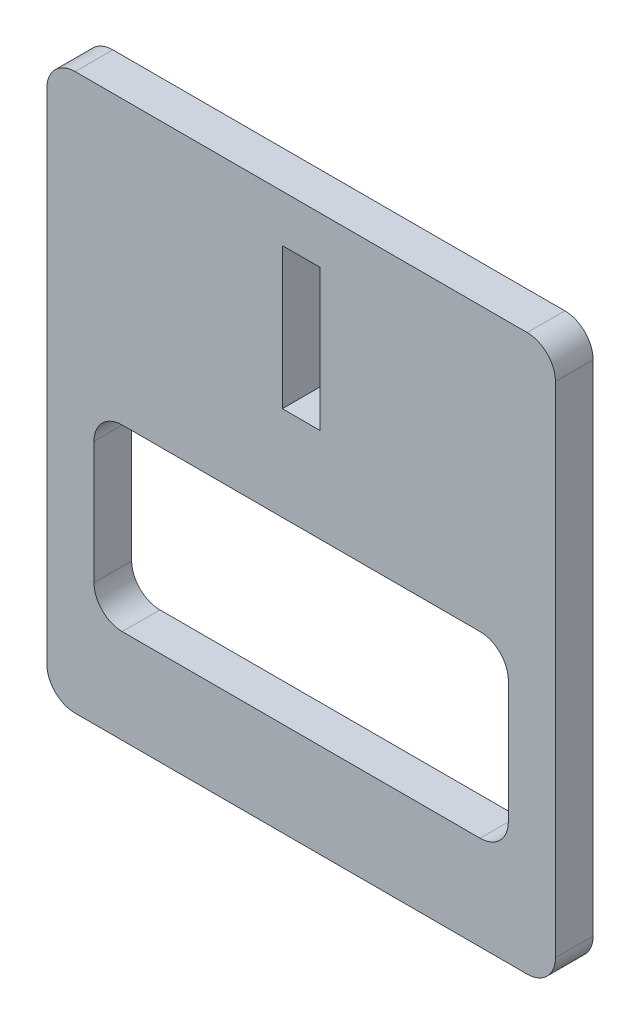
ISO-10303-21;
HEADER;
FILE_DESCRIPTION(('STEP AP214'),'2;1');
FILE_NAME('part.step','',(''),(''),'','','');
FILE_SCHEMA(('AUTOMOTIVE_DESIGN { 1 0 10303 214 1 1 1 1 }'));
ENDSEC;
DATA;
#1=APPLICATION_CONTEXT('core data for automotive mechanical design processes');
#2=APPLICATION_PROTOCOL_DEFINITION('international standard','automotive_design',2000,#1);
#3=PRODUCT_CONTEXT('',#1,'mechanical');
#4=PRODUCT('Part','Part','',(#3));
#5=PRODUCT_RELATED_PRODUCT_CATEGORY('part','',(#4));
#6=PRODUCT_DEFINITION_FORMATION('','',#4);
#7=PRODUCT_DEFINITION_CONTEXT('part definition',#1,'design');
#8=PRODUCT_DEFINITION('design','',#6,#7);
#9=PRODUCT_DEFINITION_SHAPE('','',#8);
#10=(LENGTH_UNIT() NAMED_UNIT(*) SI_UNIT(.MILLI.,.METRE.));
#11=(NAMED_UNIT(*) PLANE_ANGLE_UNIT() SI_UNIT($,.RADIAN.));
#12=(NAMED_UNIT(*) SI_UNIT($,.STERADIAN.) SOLID_ANGLE_UNIT());
#13=UNCERTAINTY_MEASURE_WITH_UNIT(LENGTH_MEASURE(1.E-05),#10,'distance_accuracy_value','');
#14=(GEOMETRIC_REPRESENTATION_CONTEXT(3) GLOBAL_UNCERTAINTY_ASSIGNED_CONTEXT((#13)) GLOBAL_UNIT_ASSIGNED_CONTEXT((#10,
#11,#12)) REPRESENTATION_CONTEXT('',''));
#15=CARTESIAN_POINT('',(0.,0.,0.));
#16=DIRECTION('',(0.,0.,1.));
#17=DIRECTION('',(1.,0.,0.));
#18=AXIS2_PLACEMENT_3D('',#15,#16,#17);
#19=CARTESIAN_POINT('',(-2.,46.,4.));
#20=DIRECTION('',(0.,0.,-1.));
#21=DIRECTION('',(-1.,0.,0.));
#22=AXIS2_PLACEMENT_3D('',#19,#20,#21);
#23=PLANE('',#22);
#24=CARTESIAN_POINT('',(41.,16.,4.));
#25=DIRECTION('',(0.,0.,1.));
#26=DIRECTION('',(-1.,0.,0.));
#27=AXIS2_PLACEMENT_3D('',#24,#25,#26);
#28=CIRCLE('',#27,3.);
#29=CARTESIAN_POINT('',(44.,16.,4.));
#30=VERTEX_POINT('',#29);
#31=CARTESIAN_POINT('',(41.,19.,4.));
#32=VERTEX_POINT('',#31);
#33=EDGE_CURVE('E208',#30,#32,#28,.T.);
#34=ORIENTED_EDGE('',*,*,#33,.F.);
#35=DIRECTION('',(0.,1.,0.));
#36=VECTOR('',#35,1.);
#37=CARTESIAN_POINT('',(44.,3.00000000000002,4.));
#38=LINE('',#37,#36);
#39=CARTESIAN_POINT('',(44.,3.,4.));
#40=VERTEX_POINT('',#39);
#41=EDGE_CURVE('E224',#40,#30,#38,.T.);
#42=ORIENTED_EDGE('',*,*,#41,.F.);
#43=CARTESIAN_POINT('',(41.,3.,4.));
#44=DIRECTION('',(0.,0.,1.));
#45=DIRECTION('',(1.,0.,0.));
#46=AXIS2_PLACEMENT_3D('',#43,#44,#45);
#47=CIRCLE('',#46,3.);
#48=CARTESIAN_POINT('',(41.,0.,4.));
#49=VERTEX_POINT('',#48);
#50=EDGE_CURVE('E221',#49,#40,#47,.T.);
#51=ORIENTED_EDGE('',*,*,#50,.F.);
#52=DIRECTION('',(1.,0.,0.));
#53=VECTOR('',#52,1.);
#54=CARTESIAN_POINT('',(3.00000000000002,0.,4.));
#55=LINE('',#54,#53);
#56=CARTESIAN_POINT('',(3.00000000000002,0.,4.));
#57=VERTEX_POINT('',#56);
#58=EDGE_CURVE('E219',#57,#49,#55,.T.);
#59=ORIENTED_EDGE('',*,*,#58,.F.);
#60=CARTESIAN_POINT('',(3.,3.,4.));
#61=DIRECTION('',(0.,0.,1.));
#62=DIRECTION('',(-1.,0.,0.));
#63=AXIS2_PLACEMENT_3D('',#60,#61,#62);
#64=CIRCLE('',#63,3.);
#65=CARTESIAN_POINT('',(0.,3.00000000000002,4.));
#66=VERTEX_POINT('',#65);
#67=EDGE_CURVE('E217',#66,#57,#64,.T.);
#68=ORIENTED_EDGE('',*,*,#67,.F.);
#69=DIRECTION('',(0.,-1.,0.));
#70=VECTOR('',#69,1.);
#71=CARTESIAN_POINT('',(0.,3.00000000000002,4.));
#72=LINE('',#71,#70);
#73=CARTESIAN_POINT('',(0.,16.,4.));
#74=VERTEX_POINT('',#73);
#75=EDGE_CURVE('E215',#74,#66,#72,.T.);
#76=ORIENTED_EDGE('',*,*,#75,.F.);
#77=CARTESIAN_POINT('',(3.,16.,4.));
#78=DIRECTION('',(0.,0.,1.));
#79=DIRECTION('',(-1.,0.,0.));
#80=AXIS2_PLACEMENT_3D('',#77,#78,#79);
#81=CIRCLE('',#80,3.);
#82=CARTESIAN_POINT('',(3.00000000000002,19.,4.));
#83=VERTEX_POINT('',#82);
#84=EDGE_CURVE('E213',#83,#74,#81,.T.);
#85=ORIENTED_EDGE('',*,*,#84,.F.);
#86=DIRECTION('',(-1.,0.,0.));
#87=VECTOR('',#86,1.);
#88=CARTESIAN_POINT('',(3.00000000000002,19.,4.));
#89=LINE('',#88,#87);
#90=EDGE_CURVE('E210',#32,#83,#89,.T.);
#91=ORIENTED_EDGE('',*,*,#90,.F.);
#92=EDGE_LOOP('',(#34,#42,#51,#59,#68,#76,#85,#91));
#93=FACE_BOUND('',#92,.T.);
#94=CARTESIAN_POINT('',(-2.,46.,4.));
#95=DIRECTION('',(0.,0.,1.));
#96=DIRECTION('',(-1.,0.,0.));
#97=AXIS2_PLACEMENT_3D('',#94,#95,#96);
#98=CIRCLE('',#97,3.);
#99=CARTESIAN_POINT('',(-1.99999999999998,49.,4.));
#100=VERTEX_POINT('',#99);
#101=CARTESIAN_POINT('',(-5.,46.,4.));
#102=VERTEX_POINT('',#101);
#103=EDGE_CURVE('E267',#100,#102,#98,.T.);
#104=ORIENTED_EDGE('',*,*,#103,.T.);
#105=DIRECTION('',(0.,-1.,0.));
#106=VECTOR('',#105,1.);
#107=CARTESIAN_POINT('',(-5.,-6.99999999999998,4.));
#108=LINE('',#107,#106);
#109=CARTESIAN_POINT('',(-5.,-6.99999999999998,4.));
#110=VERTEX_POINT('',#109);
#111=EDGE_CURVE('E270',#102,#110,#108,.T.);
#112=ORIENTED_EDGE('',*,*,#111,.T.);
#113=CARTESIAN_POINT('',(-2.,-7.,4.));
#114=DIRECTION('',(0.,0.,1.));
#115=DIRECTION('',(-1.,0.,0.));
#116=AXIS2_PLACEMENT_3D('',#113,#114,#115);
#117=CIRCLE('',#116,3.);
#118=CARTESIAN_POINT('',(-1.99999999999998,-10.,4.));
#119=VERTEX_POINT('',#118);
#120=EDGE_CURVE('E273',#110,#119,#117,.T.);
#121=ORIENTED_EDGE('',*,*,#120,.T.);
#122=DIRECTION('',(1.,0.,0.));
#123=VECTOR('',#122,1.);
#124=CARTESIAN_POINT('',(-1.99999999999998,-10.,4.));
#125=LINE('',#124,#123);
#126=CARTESIAN_POINT('',(46.,-10.,4.));
#127=VERTEX_POINT('',#126);
#128=EDGE_CURVE('E275',#119,#127,#125,.T.);
#129=ORIENTED_EDGE('',*,*,#128,.T.);
#130=CARTESIAN_POINT('',(46.,-7.,4.));
#131=DIRECTION('',(0.,0.,1.));
#132=DIRECTION('',(1.,0.,0.));
#133=AXIS2_PLACEMENT_3D('',#130,#131,#132);
#134=CIRCLE('',#133,3.);
#135=CARTESIAN_POINT('',(49.,-7.,4.));
#136=VERTEX_POINT('',#135);
#137=EDGE_CURVE('E277',#127,#136,#134,.T.);
#138=ORIENTED_EDGE('',*,*,#137,.T.);
#139=DIRECTION('',(0.,1.,0.));
#140=VECTOR('',#139,1.);
#141=CARTESIAN_POINT('',(49.,-6.99999999999998,4.));
#142=LINE('',#141,#140);
#143=CARTESIAN_POINT('',(49.,46.,4.));
#144=VERTEX_POINT('',#143);
#145=EDGE_CURVE('E279',#136,#144,#142,.T.);
#146=ORIENTED_EDGE('',*,*,#145,.T.);
#147=CARTESIAN_POINT('',(46.,46.,4.));
#148=DIRECTION('',(0.,0.,1.));
#149=DIRECTION('',(-1.,0.,0.));
#150=AXIS2_PLACEMENT_3D('',#147,#148,#149);
#151=CIRCLE('',#150,3.);
#152=CARTESIAN_POINT('',(46.,49.,4.));
#153=VERTEX_POINT('',#152);
#154=EDGE_CURVE('E281',#144,#153,#151,.T.);
#155=ORIENTED_EDGE('',*,*,#154,.T.);
#156=DIRECTION('',(-1.,0.,0.));
#157=VECTOR('',#156,1.);
#158=CARTESIAN_POINT('',(-1.99999999999998,49.,4.));
#159=LINE('',#158,#157);
#160=EDGE_CURVE('E283',#153,#100,#159,.T.);
#161=ORIENTED_EDGE('',*,*,#160,.T.);
#162=EDGE_LOOP('',(#104,#112,#121,#129,#138,#146,#155,#161));
#163=FACE_BOUND('',#162,.T.);
#164=DIRECTION('',(0.,1.,0.));
#165=VECTOR('',#164,1.);
#166=CARTESIAN_POINT('',(24.,29.,4.));
#167=LINE('',#166,#165);
#168=CARTESIAN_POINT('',(24.,29.,4.));
#169=VERTEX_POINT('',#168);
#170=CARTESIAN_POINT('',(24.,44.,4.));
#171=VERTEX_POINT('',#170);
#172=EDGE_CURVE('E172',#169,#171,#167,.T.);
#173=ORIENTED_EDGE('',*,*,#172,.F.);
#174=DIRECTION('',(1.,0.,0.));
#175=VECTOR('',#174,1.);
#176=CARTESIAN_POINT('',(20.,29.,4.));
#177=LINE('',#176,#175);
#178=CARTESIAN_POINT('',(20.,29.,4.));
#179=VERTEX_POINT('',#178);
#180=EDGE_CURVE('E194',#179,#169,#177,.T.);
#181=ORIENTED_EDGE('',*,*,#180,.F.);
#182=DIRECTION('',(0.,-1.,0.));
#183=VECTOR('',#182,1.);
#184=CARTESIAN_POINT('',(20.,29.,4.));
#185=LINE('',#184,#183);
#186=CARTESIAN_POINT('',(20.,44.,4.));
#187=VERTEX_POINT('',#186);
#188=EDGE_CURVE('E192',#187,#179,#185,.T.);
#189=ORIENTED_EDGE('',*,*,#188,.F.);
#190=DIRECTION('',(-1.,0.,0.));
#191=VECTOR('',#190,1.);
#192=CARTESIAN_POINT('',(20.,44.,4.));
#193=LINE('',#192,#191);
#194=EDGE_CURVE('E180',#171,#187,#193,.T.);
#195=ORIENTED_EDGE('',*,*,#194,.F.);
#196=EDGE_LOOP('',(#173,#181,#189,#195));
#197=FACE_BOUND('',#196,.T.);
#198=ADVANCED_FACE('F35',(#93,#163,#197),#23,.F.);
#199=CARTESIAN_POINT('',(-2.,46.,0.));
#200=DIRECTION('',(0.,0.,-1.));
#201=DIRECTION('',(-1.,0.,0.));
#202=AXIS2_PLACEMENT_3D('',#199,#200,#201);
#203=PLANE('',#202);
#204=CARTESIAN_POINT('',(-2.,46.,0.));
#205=DIRECTION('',(0.,0.,1.));
#206=DIRECTION('',(-1.,0.,0.));
#207=AXIS2_PLACEMENT_3D('',#204,#205,#206);
#208=CIRCLE('',#207,3.);
#209=CARTESIAN_POINT('',(-1.99999999999998,49.,0.));
#210=VERTEX_POINT('',#209);
#211=CARTESIAN_POINT('',(-5.,46.,0.));
#212=VERTEX_POINT('',#211);
#213=EDGE_CURVE('E266',#210,#212,#208,.T.);
#214=ORIENTED_EDGE('',*,*,#213,.F.);
#215=DIRECTION('',(-1.,0.,0.));
#216=VECTOR('',#215,1.);
#217=CARTESIAN_POINT('',(-1.99999999999998,49.,0.));
#218=LINE('',#217,#216);
#219=CARTESIAN_POINT('',(46.,49.,0.));
#220=VERTEX_POINT('',#219);
#221=EDGE_CURVE('E271',#220,#210,#218,.T.);
#222=ORIENTED_EDGE('',*,*,#221,.F.);
#223=CARTESIAN_POINT('',(46.,46.,0.));
#224=DIRECTION('',(0.,0.,1.));
#225=DIRECTION('',(-1.,0.,0.));
#226=AXIS2_PLACEMENT_3D('',#223,#224,#225);
#227=CIRCLE('',#226,3.);
#228=CARTESIAN_POINT('',(49.,46.,0.));
#229=VERTEX_POINT('',#228);
#230=EDGE_CURVE('E298',#229,#220,#227,.T.);
#231=ORIENTED_EDGE('',*,*,#230,.F.);
#232=DIRECTION('',(0.,1.,0.));
#233=VECTOR('',#232,1.);
#234=CARTESIAN_POINT('',(49.,-6.99999999999998,0.));
#235=LINE('',#234,#233);
#236=CARTESIAN_POINT('',(49.,-7.,0.));
#237=VERTEX_POINT('',#236);
#238=EDGE_CURVE('E296',#237,#229,#235,.T.);
#239=ORIENTED_EDGE('',*,*,#238,.F.);
#240=CARTESIAN_POINT('',(46.,-7.,0.));
#241=DIRECTION('',(0.,0.,1.));
#242=DIRECTION('',(1.,0.,0.));
#243=AXIS2_PLACEMENT_3D('',#240,#241,#242);
#244=CIRCLE('',#243,3.);
#245=CARTESIAN_POINT('',(46.,-10.,0.));
#246=VERTEX_POINT('',#245);
#247=EDGE_CURVE('E294',#246,#237,#244,.T.);
#248=ORIENTED_EDGE('',*,*,#247,.F.);
#249=DIRECTION('',(1.,0.,0.));
#250=VECTOR('',#249,1.);
#251=CARTESIAN_POINT('',(-1.99999999999998,-10.,0.));
#252=LINE('',#251,#250);
#253=CARTESIAN_POINT('',(-1.99999999999998,-10.,0.));
#254=VERTEX_POINT('',#253);
#255=EDGE_CURVE('E292',#254,#246,#252,.T.);
#256=ORIENTED_EDGE('',*,*,#255,.F.);
#257=CARTESIAN_POINT('',(-2.,-7.,0.));
#258=DIRECTION('',(0.,0.,1.));
#259=DIRECTION('',(-1.,0.,0.));
#260=AXIS2_PLACEMENT_3D('',#257,#258,#259);
#261=CIRCLE('',#260,3.);
#262=CARTESIAN_POINT('',(-5.,-6.99999999999998,0.));
#263=VERTEX_POINT('',#262);
#264=EDGE_CURVE('E290',#263,#254,#261,.T.);
#265=ORIENTED_EDGE('',*,*,#264,.F.);
#266=DIRECTION('',(0.,-1.,0.));
#267=VECTOR('',#266,1.);
#268=CARTESIAN_POINT('',(-5.,-6.99999999999998,0.));
#269=LINE('',#268,#267);
#270=EDGE_CURVE('E288',#212,#263,#269,.T.);
#271=ORIENTED_EDGE('',*,*,#270,.F.);
#272=EDGE_LOOP('',(#214,#222,#231,#239,#248,#256,#265,#271));
#273=FACE_BOUND('',#272,.T.);
#274=DIRECTION('',(0.,1.,0.));
#275=VECTOR('',#274,1.);
#276=CARTESIAN_POINT('',(44.,3.00000000000002,0.));
#277=LINE('',#276,#275);
#278=CARTESIAN_POINT('',(44.,3.,0.));
#279=VERTEX_POINT('',#278);
#280=CARTESIAN_POINT('',(44.,16.,0.));
#281=VERTEX_POINT('',#280);
#282=EDGE_CURVE('E211',#279,#281,#277,.T.);
#283=ORIENTED_EDGE('',*,*,#282,.T.);
#284=CARTESIAN_POINT('',(41.,16.,0.));
#285=DIRECTION('',(0.,0.,1.));
#286=DIRECTION('',(-1.,0.,0.));
#287=AXIS2_PLACEMENT_3D('',#284,#285,#286);
#288=CIRCLE('',#287,3.);
#289=CARTESIAN_POINT('',(41.,19.,0.));
#290=VERTEX_POINT('',#289);
#291=EDGE_CURVE('E188',#281,#290,#288,.T.);
#292=ORIENTED_EDGE('',*,*,#291,.T.);
#293=DIRECTION('',(-1.,0.,0.));
#294=VECTOR('',#293,1.);
#295=CARTESIAN_POINT('',(3.00000000000002,19.,0.));
#296=LINE('',#295,#294);
#297=CARTESIAN_POINT('',(3.00000000000002,19.,0.));
#298=VERTEX_POINT('',#297);
#299=EDGE_CURVE('E229',#290,#298,#296,.T.);
#300=ORIENTED_EDGE('',*,*,#299,.T.);
#301=CARTESIAN_POINT('',(3.,16.,0.));
#302=DIRECTION('',(0.,0.,1.));
#303=DIRECTION('',(-1.,0.,0.));
#304=AXIS2_PLACEMENT_3D('',#301,#302,#303);
#305=CIRCLE('',#304,3.);
#306=CARTESIAN_POINT('',(0.,16.,0.));
#307=VERTEX_POINT('',#306);
#308=EDGE_CURVE('E232',#298,#307,#305,.T.);
#309=ORIENTED_EDGE('',*,*,#308,.T.);
#310=DIRECTION('',(0.,-1.,0.));
#311=VECTOR('',#310,1.);
#312=CARTESIAN_POINT('',(0.,3.00000000000002,0.));
#313=LINE('',#312,#311);
#314=CARTESIAN_POINT('',(0.,3.00000000000002,0.));
#315=VERTEX_POINT('',#314);
#316=EDGE_CURVE('E235',#307,#315,#313,.T.);
#317=ORIENTED_EDGE('',*,*,#316,.T.);
#318=CARTESIAN_POINT('',(3.,3.,0.));
#319=DIRECTION('',(0.,0.,1.));
#320=DIRECTION('',(-1.,0.,0.));
#321=AXIS2_PLACEMENT_3D('',#318,#319,#320);
#322=CIRCLE('',#321,3.);
#323=CARTESIAN_POINT('',(3.00000000000002,0.,0.));
#324=VERTEX_POINT('',#323);
#325=EDGE_CURVE('E238',#315,#324,#322,.T.);
#326=ORIENTED_EDGE('',*,*,#325,.T.);
#327=DIRECTION('',(1.,0.,0.));
#328=VECTOR('',#327,1.);
#329=CARTESIAN_POINT('',(3.00000000000002,0.,0.));
#330=LINE('',#329,#328);
#331=CARTESIAN_POINT('',(41.,0.,0.));
#332=VERTEX_POINT('',#331);
#333=EDGE_CURVE('E241',#324,#332,#330,.T.);
#334=ORIENTED_EDGE('',*,*,#333,.T.);
#335=CARTESIAN_POINT('',(41.,3.,0.));
#336=DIRECTION('',(0.,0.,1.));
#337=DIRECTION('',(1.,0.,0.));
#338=AXIS2_PLACEMENT_3D('',#335,#336,#337);
#339=CIRCLE('',#338,3.);
#340=EDGE_CURVE('E244',#332,#279,#339,.T.);
#341=ORIENTED_EDGE('',*,*,#340,.T.);
#342=EDGE_LOOP('',(#283,#292,#300,#309,#317,#326,#334,#341));
#343=FACE_BOUND('',#342,.T.);
#344=DIRECTION('',(1.,0.,0.));
#345=VECTOR('',#344,1.);
#346=CARTESIAN_POINT('',(20.,29.,0.));
#347=LINE('',#346,#345);
#348=CARTESIAN_POINT('',(20.,29.,0.));
#349=VERTEX_POINT('',#348);
#350=CARTESIAN_POINT('',(24.,29.,0.));
#351=VERTEX_POINT('',#350);
#352=EDGE_CURVE('E181',#349,#351,#347,.T.);
#353=ORIENTED_EDGE('',*,*,#352,.T.);
#354=DIRECTION('',(0.,1.,0.));
#355=VECTOR('',#354,1.);
#356=CARTESIAN_POINT('',(24.,29.,0.));
#357=LINE('',#356,#355);
#358=CARTESIAN_POINT('',(24.,44.,0.));
#359=VERTEX_POINT('',#358);
#360=EDGE_CURVE('E58',#351,#359,#357,.T.);
#361=ORIENTED_EDGE('',*,*,#360,.T.);
#362=DIRECTION('',(-1.,0.,0.));
#363=VECTOR('',#362,1.);
#364=CARTESIAN_POINT('',(20.,44.,0.));
#365=LINE('',#364,#363);
#366=CARTESIAN_POINT('',(20.,44.,0.));
#367=VERTEX_POINT('',#366);
#368=EDGE_CURVE('E187',#359,#367,#365,.T.);
#369=ORIENTED_EDGE('',*,*,#368,.T.);
#370=DIRECTION('',(0.,-1.,0.));
#371=VECTOR('',#370,1.);
#372=CARTESIAN_POINT('',(20.,29.,0.));
#373=LINE('',#372,#371);
#374=EDGE_CURVE('E200',#367,#349,#373,.T.);
#375=ORIENTED_EDGE('',*,*,#374,.T.);
#376=EDGE_LOOP('',(#353,#361,#369,#375));
#377=FACE_BOUND('',#376,.T.);
#378=ADVANCED_FACE('F328',(#273,#343,#377),#203,.T.);
#379=CARTESIAN_POINT('',(-2.,46.,4.));
#380=DIRECTION('',(0.,0.,-1.));
#381=DIRECTION('',(-1.,0.,0.));
#382=AXIS2_PLACEMENT_3D('',#379,#380,#381);
#383=CYLINDRICAL_SURFACE('',#382,3.);
#384=ORIENTED_EDGE('',*,*,#213,.T.);
#385=DIRECTION('',(0.,0.,-1.));
#386=VECTOR('',#385,1.);
#387=CARTESIAN_POINT('',(-5.,46.,4.));
#388=LINE('',#387,#386);
#389=EDGE_CURVE('E11',#102,#212,#388,.T.);
#390=ORIENTED_EDGE('',*,*,#389,.F.);
#391=ORIENTED_EDGE('',*,*,#103,.F.);
#392=DIRECTION('',(0.,0.,-1.));
#393=VECTOR('',#392,1.);
#394=CARTESIAN_POINT('',(-1.99999999999998,49.,4.));
#395=LINE('',#394,#393);
#396=EDGE_CURVE('E285',#100,#210,#395,.T.);
#397=ORIENTED_EDGE('',*,*,#396,.T.);
#398=EDGE_LOOP('',(#384,#390,#391,#397));
#399=FACE_BOUND('',#398,.T.);
#400=ADVANCED_FACE('F37',(#399),#383,.T.);
#401=CARTESIAN_POINT('',(-5.,-6.99999999999998,4.));
#402=DIRECTION('',(1.,0.,0.));
#403=DIRECTION('',(0.,0.,-1.));
#404=AXIS2_PLACEMENT_3D('',#401,#402,#403);
#405=PLANE('',#404);
#406=ORIENTED_EDGE('',*,*,#270,.T.);
#407=DIRECTION('',(0.,0.,-1.));
#408=VECTOR('',#407,1.);
#409=CARTESIAN_POINT('',(-5.,-6.99999999999998,4.));
#410=LINE('',#409,#408);
#411=EDGE_CURVE('E43',#110,#263,#410,.T.);
#412=ORIENTED_EDGE('',*,*,#411,.F.);
#413=ORIENTED_EDGE('',*,*,#111,.F.);
#414=ORIENTED_EDGE('',*,*,#389,.T.);
#415=EDGE_LOOP('',(#406,#412,#413,#414));
#416=FACE_BOUND('',#415,.T.);
#417=ADVANCED_FACE('F345',(#416),#405,.F.);
#418=CARTESIAN_POINT('',(-2.,-7.,4.));
#419=DIRECTION('',(0.,0.,-1.));
#420=DIRECTION('',(-1.,0.,0.));
#421=AXIS2_PLACEMENT_3D('',#418,#419,#420);
#422=CYLINDRICAL_SURFACE('',#421,3.);
#423=ORIENTED_EDGE('',*,*,#264,.T.);
#424=DIRECTION('',(0.,0.,-1.));
#425=VECTOR('',#424,1.);
#426=CARTESIAN_POINT('',(-1.99999999999998,-10.,4.));
#427=LINE('',#426,#425);
#428=EDGE_CURVE('E315',#119,#254,#427,.T.);
#429=ORIENTED_EDGE('',*,*,#428,.F.);
#430=ORIENTED_EDGE('',*,*,#120,.F.);
#431=ORIENTED_EDGE('',*,*,#411,.T.);
#432=EDGE_LOOP('',(#423,#429,#430,#431));
#433=FACE_BOUND('',#432,.T.);
#434=ADVANCED_FACE('F322',(#433),#422,.T.);
#435=CARTESIAN_POINT('',(-1.99999999999998,-10.,4.));
#436=DIRECTION('',(0.,1.,0.));
#437=DIRECTION('',(0.,0.,1.));
#438=AXIS2_PLACEMENT_3D('',#435,#436,#437);
#439=PLANE('',#438);
#440=ORIENTED_EDGE('',*,*,#255,.T.);
#441=DIRECTION('',(0.,0.,-1.));
#442=VECTOR('',#441,1.);
#443=CARTESIAN_POINT('',(46.,-10.,4.));
#444=LINE('',#443,#442);
#445=EDGE_CURVE('E312',#127,#246,#444,.T.);
#446=ORIENTED_EDGE('',*,*,#445,.F.);
#447=ORIENTED_EDGE('',*,*,#128,.F.);
#448=ORIENTED_EDGE('',*,*,#428,.T.);
#449=EDGE_LOOP('',(#440,#446,#447,#448));
#450=FACE_BOUND('',#449,.T.);
#451=ADVANCED_FACE('F334',(#450),#439,.F.);
#452=CARTESIAN_POINT('',(46.,-7.,4.));
#453=DIRECTION('',(0.,0.,-1.));
#454=DIRECTION('',(-1.,0.,0.));
#455=AXIS2_PLACEMENT_3D('',#452,#453,#454);
#456=CYLINDRICAL_SURFACE('',#455,3.);
#457=ORIENTED_EDGE('',*,*,#247,.T.);
#458=DIRECTION('',(0.,0.,-1.));
#459=VECTOR('',#458,1.);
#460=CARTESIAN_POINT('',(49.,-7.,4.));
#461=LINE('',#460,#459);
#462=EDGE_CURVE('E309',#136,#237,#461,.T.);
#463=ORIENTED_EDGE('',*,*,#462,.F.);
#464=ORIENTED_EDGE('',*,*,#137,.F.);
#465=ORIENTED_EDGE('',*,*,#445,.T.);
#466=EDGE_LOOP('',(#457,#463,#464,#465));
#467=FACE_BOUND('',#466,.T.);
#468=ADVANCED_FACE('F338',(#467),#456,.T.);
#469=CARTESIAN_POINT('',(49.,-6.99999999999998,4.));
#470=DIRECTION('',(-1.,0.,0.));
#471=DIRECTION('',(0.,0.,1.));
#472=AXIS2_PLACEMENT_3D('',#469,#470,#471);
#473=PLANE('',#472);
#474=ORIENTED_EDGE('',*,*,#238,.T.);
#475=DIRECTION('',(0.,0.,-1.));
#476=VECTOR('',#475,1.);
#477=CARTESIAN_POINT('',(49.,46.,4.));
#478=LINE('',#477,#476);
#479=EDGE_CURVE('E306',#144,#229,#478,.T.);
#480=ORIENTED_EDGE('',*,*,#479,.F.);
#481=ORIENTED_EDGE('',*,*,#145,.F.);
#482=ORIENTED_EDGE('',*,*,#462,.T.);
#483=EDGE_LOOP('',(#474,#480,#481,#482));
#484=FACE_BOUND('',#483,.T.);
#485=ADVANCED_FACE('F358',(#484),#473,.F.);
#486=CARTESIAN_POINT('',(46.,46.,4.));
#487=DIRECTION('',(0.,0.,-1.));
#488=DIRECTION('',(-1.,0.,0.));
#489=AXIS2_PLACEMENT_3D('',#486,#487,#488);
#490=CYLINDRICAL_SURFACE('',#489,3.);
#491=ORIENTED_EDGE('',*,*,#230,.T.);
#492=DIRECTION('',(0.,0.,-1.));
#493=VECTOR('',#492,1.);
#494=CARTESIAN_POINT('',(46.,49.,4.));
#495=LINE('',#494,#493);
#496=EDGE_CURVE('E303',#153,#220,#495,.T.);
#497=ORIENTED_EDGE('',*,*,#496,.F.);
#498=ORIENTED_EDGE('',*,*,#154,.F.);
#499=ORIENTED_EDGE('',*,*,#479,.T.);
#500=EDGE_LOOP('',(#491,#497,#498,#499));
#501=FACE_BOUND('',#500,.T.);
#502=ADVANCED_FACE('F356',(#501),#490,.T.);
#503=CARTESIAN_POINT('',(-1.99999999999998,49.,4.));
#504=DIRECTION('',(0.,-1.,0.));
#505=DIRECTION('',(0.,0.,-1.));
#506=AXIS2_PLACEMENT_3D('',#503,#504,#505);
#507=PLANE('',#506);
#508=ORIENTED_EDGE('',*,*,#221,.T.);
#509=ORIENTED_EDGE('',*,*,#396,.F.);
#510=ORIENTED_EDGE('',*,*,#160,.F.);
#511=ORIENTED_EDGE('',*,*,#496,.T.);
#512=EDGE_LOOP('',(#508,#509,#510,#511));
#513=FACE_BOUND('',#512,.T.);
#514=ADVANCED_FACE('F351',(#513),#507,.F.);
#515=CARTESIAN_POINT('',(41.,16.,4.));
#516=DIRECTION('',(0.,0.,-1.));
#517=DIRECTION('',(-1.,0.,0.));
#518=AXIS2_PLACEMENT_3D('',#515,#516,#517);
#519=CYLINDRICAL_SURFACE('',#518,3.);
#520=ORIENTED_EDGE('',*,*,#291,.F.);
#521=DIRECTION('',(0.,0.,-1.));
#522=VECTOR('',#521,1.);
#523=CARTESIAN_POINT('',(44.,16.,4.));
#524=LINE('',#523,#522);
#525=EDGE_CURVE('E226',#30,#281,#524,.T.);
#526=ORIENTED_EDGE('',*,*,#525,.F.);
#527=ORIENTED_EDGE('',*,*,#33,.T.);
#528=DIRECTION('',(0.,0.,-1.));
#529=VECTOR('',#528,1.);
#530=CARTESIAN_POINT('',(41.,19.,4.));
#531=LINE('',#530,#529);
#532=EDGE_CURVE('E263',#32,#290,#531,.T.);
#533=ORIENTED_EDGE('',*,*,#532,.T.);
#534=EDGE_LOOP('',(#520,#526,#527,#533));
#535=FACE_BOUND('',#534,.T.);
#536=ADVANCED_FACE('F376',(#535),#519,.F.);
#537=CARTESIAN_POINT('',(3.00000000000002,19.,4.));
#538=DIRECTION('',(0.,-1.,0.));
#539=DIRECTION('',(0.,0.,-1.));
#540=AXIS2_PLACEMENT_3D('',#537,#538,#539);
#541=PLANE('',#540);
#542=ORIENTED_EDGE('',*,*,#299,.F.);
#543=ORIENTED_EDGE('',*,*,#532,.F.);
#544=ORIENTED_EDGE('',*,*,#90,.T.);
#545=DIRECTION('',(0.,0.,-1.));
#546=VECTOR('',#545,1.);
#547=CARTESIAN_POINT('',(3.00000000000002,19.,4.));
#548=LINE('',#547,#546);
#549=EDGE_CURVE('E261',#83,#298,#548,.T.);
#550=ORIENTED_EDGE('',*,*,#549,.T.);
#551=EDGE_LOOP('',(#542,#543,#544,#550));
#552=FACE_BOUND('',#551,.T.);
#553=ADVANCED_FACE('F383',(#552),#541,.T.);
#554=CARTESIAN_POINT('',(3.,16.,4.));
#555=DIRECTION('',(0.,0.,-1.));
#556=DIRECTION('',(-1.,0.,0.));
#557=AXIS2_PLACEMENT_3D('',#554,#555,#556);
#558=CYLINDRICAL_SURFACE('',#557,3.);
#559=ORIENTED_EDGE('',*,*,#308,.F.);
#560=ORIENTED_EDGE('',*,*,#549,.F.);
#561=ORIENTED_EDGE('',*,*,#84,.T.);
#562=DIRECTION('',(0.,0.,-1.));
#563=VECTOR('',#562,1.);
#564=CARTESIAN_POINT('',(0.,16.,4.));
#565=LINE('',#564,#563);
#566=EDGE_CURVE('E259',#74,#307,#565,.T.);
#567=ORIENTED_EDGE('',*,*,#566,.T.);
#568=EDGE_LOOP('',(#559,#560,#561,#567));
#569=FACE_BOUND('',#568,.T.);
#570=ADVANCED_FACE('F388',(#569),#558,.F.);
#571=CARTESIAN_POINT('',(0.,3.00000000000002,4.));
#572=DIRECTION('',(1.,0.,0.));
#573=DIRECTION('',(0.,0.,-1.));
#574=AXIS2_PLACEMENT_3D('',#571,#572,#573);
#575=PLANE('',#574);
#576=ORIENTED_EDGE('',*,*,#316,.F.);
#577=ORIENTED_EDGE('',*,*,#566,.F.);
#578=ORIENTED_EDGE('',*,*,#75,.T.);
#579=DIRECTION('',(0.,0.,-1.));
#580=VECTOR('',#579,1.);
#581=CARTESIAN_POINT('',(0.,3.00000000000002,4.));
#582=LINE('',#581,#580);
#583=EDGE_CURVE('E257',#66,#315,#582,.T.);
#584=ORIENTED_EDGE('',*,*,#583,.T.);
#585=EDGE_LOOP('',(#576,#577,#578,#584));
#586=FACE_BOUND('',#585,.T.);
#587=ADVANCED_FACE('F413',(#586),#575,.T.);
#588=CARTESIAN_POINT('',(3.,3.,4.));
#589=DIRECTION('',(0.,0.,-1.));
#590=DIRECTION('',(-1.,0.,0.));
#591=AXIS2_PLACEMENT_3D('',#588,#589,#590);
#592=CYLINDRICAL_SURFACE('',#591,3.);
#593=ORIENTED_EDGE('',*,*,#325,.F.);
#594=ORIENTED_EDGE('',*,*,#583,.F.);
#595=ORIENTED_EDGE('',*,*,#67,.T.);
#596=DIRECTION('',(0.,0.,-1.));
#597=VECTOR('',#596,1.);
#598=CARTESIAN_POINT('',(3.00000000000002,0.,4.));
#599=LINE('',#598,#597);
#600=EDGE_CURVE('E255',#57,#324,#599,.T.);
#601=ORIENTED_EDGE('',*,*,#600,.T.);
#602=EDGE_LOOP('',(#593,#594,#595,#601));
#603=FACE_BOUND('',#602,.T.);
#604=ADVANCED_FACE('F418',(#603),#592,.F.);
#605=CARTESIAN_POINT('',(3.00000000000002,0.,4.));
#606=DIRECTION('',(0.,1.,0.));
#607=DIRECTION('',(0.,0.,1.));
#608=AXIS2_PLACEMENT_3D('',#605,#606,#607);
#609=PLANE('',#608);
#610=ORIENTED_EDGE('',*,*,#333,.F.);
#611=ORIENTED_EDGE('',*,*,#600,.F.);
#612=ORIENTED_EDGE('',*,*,#58,.T.);
#613=DIRECTION('',(0.,0.,-1.));
#614=VECTOR('',#613,1.);
#615=CARTESIAN_POINT('',(41.,0.,4.));
#616=LINE('',#615,#614);
#617=EDGE_CURVE('E253',#49,#332,#616,.T.);
#618=ORIENTED_EDGE('',*,*,#617,.T.);
#619=EDGE_LOOP('',(#610,#611,#612,#618));
#620=FACE_BOUND('',#619,.T.);
#621=ADVANCED_FACE('F421',(#620),#609,.T.);
#622=CARTESIAN_POINT('',(41.,3.,4.));
#623=DIRECTION('',(0.,0.,-1.));
#624=DIRECTION('',(-1.,0.,0.));
#625=AXIS2_PLACEMENT_3D('',#622,#623,#624);
#626=CYLINDRICAL_SURFACE('',#625,3.);
#627=ORIENTED_EDGE('',*,*,#340,.F.);
#628=ORIENTED_EDGE('',*,*,#617,.F.);
#629=ORIENTED_EDGE('',*,*,#50,.T.);
#630=DIRECTION('',(0.,0.,-1.));
#631=VECTOR('',#630,1.);
#632=CARTESIAN_POINT('',(44.,3.,4.));
#633=LINE('',#632,#631);
#634=EDGE_CURVE('E251',#40,#279,#633,.T.);
#635=ORIENTED_EDGE('',*,*,#634,.T.);
#636=EDGE_LOOP('',(#627,#628,#629,#635));
#637=FACE_BOUND('',#636,.T.);
#638=ADVANCED_FACE('F401',(#637),#626,.F.);
#639=CARTESIAN_POINT('',(44.,3.00000000000002,4.));
#640=DIRECTION('',(-1.,0.,0.));
#641=DIRECTION('',(0.,0.,1.));
#642=AXIS2_PLACEMENT_3D('',#639,#640,#641);
#643=PLANE('',#642);
#644=ORIENTED_EDGE('',*,*,#282,.F.);
#645=ORIENTED_EDGE('',*,*,#634,.F.);
#646=ORIENTED_EDGE('',*,*,#41,.T.);
#647=ORIENTED_EDGE('',*,*,#525,.T.);
#648=EDGE_LOOP('',(#644,#645,#646,#647));
#649=FACE_BOUND('',#648,.T.);
#650=ADVANCED_FACE('F394',(#649),#643,.T.);
#651=CARTESIAN_POINT('',(24.,29.,4.));
#652=DIRECTION('',(-1.,0.,0.));
#653=DIRECTION('',(0.,0.,1.));
#654=AXIS2_PLACEMENT_3D('',#651,#652,#653);
#655=PLANE('',#654);
#656=ORIENTED_EDGE('',*,*,#360,.F.);
#657=DIRECTION('',(0.,0.,-1.));
#658=VECTOR('',#657,1.);
#659=CARTESIAN_POINT('',(24.,29.,4.));
#660=LINE('',#659,#658);
#661=EDGE_CURVE('E176',#169,#351,#660,.T.);
#662=ORIENTED_EDGE('',*,*,#661,.F.);
#663=ORIENTED_EDGE('',*,*,#172,.T.);
#664=DIRECTION('',(0.,0.,-1.));
#665=VECTOR('',#664,1.);
#666=CARTESIAN_POINT('',(24.,44.,4.));
#667=LINE('',#666,#665);
#668=EDGE_CURVE('E175',#171,#359,#667,.T.);
#669=ORIENTED_EDGE('',*,*,#668,.T.);
#670=EDGE_LOOP('',(#656,#662,#663,#669));
#671=FACE_BOUND('',#670,.T.);
#672=ADVANCED_FACE('F174',(#671),#655,.T.);
#673=CARTESIAN_POINT('',(20.,44.,4.));
#674=DIRECTION('',(0.,-1.,0.));
#675=DIRECTION('',(1.,0.,0.));
#676=AXIS2_PLACEMENT_3D('',#673,#674,#675);
#677=PLANE('',#676);
#678=ORIENTED_EDGE('',*,*,#368,.F.);
#679=ORIENTED_EDGE('',*,*,#668,.F.);
#680=ORIENTED_EDGE('',*,*,#194,.T.);
#681=DIRECTION('',(0.,0.,-1.));
#682=VECTOR('',#681,1.);
#683=CARTESIAN_POINT('',(20.,44.,4.));
#684=LINE('',#683,#682);
#685=EDGE_CURVE('E189',#187,#367,#684,.T.);
#686=ORIENTED_EDGE('',*,*,#685,.T.);
#687=EDGE_LOOP('',(#678,#679,#680,#686));
#688=FACE_BOUND('',#687,.T.);
#689=ADVANCED_FACE('F184',(#688),#677,.T.);
#690=CARTESIAN_POINT('',(20.,29.,4.));
#691=DIRECTION('',(1.,0.,0.));
#692=DIRECTION('',(0.,0.,-1.));
#693=AXIS2_PLACEMENT_3D('',#690,#691,#692);
#694=PLANE('',#693);
#695=ORIENTED_EDGE('',*,*,#374,.F.);
#696=ORIENTED_EDGE('',*,*,#685,.F.);
#697=ORIENTED_EDGE('',*,*,#188,.T.);
#698=DIRECTION('',(0.,0.,-1.));
#699=VECTOR('',#698,1.);
#700=CARTESIAN_POINT('',(20.,29.,4.));
#701=LINE('',#700,#699);
#702=EDGE_CURVE('E50',#179,#349,#701,.T.);
#703=ORIENTED_EDGE('',*,*,#702,.T.);
#704=EDGE_LOOP('',(#695,#696,#697,#703));
#705=FACE_BOUND('',#704,.T.);
#706=ADVANCED_FACE('F481',(#705),#694,.T.);
#707=CARTESIAN_POINT('',(20.,29.,4.));
#708=DIRECTION('',(0.,1.,0.));
#709=DIRECTION('',(-1.,0.,0.));
#710=AXIS2_PLACEMENT_3D('',#707,#708,#709);
#711=PLANE('',#710);
#712=ORIENTED_EDGE('',*,*,#352,.F.);
#713=ORIENTED_EDGE('',*,*,#702,.F.);
#714=ORIENTED_EDGE('',*,*,#180,.T.);
#715=ORIENTED_EDGE('',*,*,#661,.T.);
#716=EDGE_LOOP('',(#712,#713,#714,#715));
#717=FACE_BOUND('',#716,.T.);
#718=ADVANCED_FACE('F490',(#717),#711,.T.);
#719=CLOSED_SHELL('',(#198,#378,#400,#417,#434,#451,#468,#485,#502,#514,#536,#553,#570,#587,
#604,#621,#638,#650,#672,#689,#706,#718));
#720=MANIFOLD_SOLID_BREP('B2',#719);
#721=ADVANCED_BREP_SHAPE_REPRESENTATION('',(#18,#720),#14);
#722=SHAPE_DEFINITION_REPRESENTATION(#9,#721);
ENDSEC;
END-ISO-10303-21;
